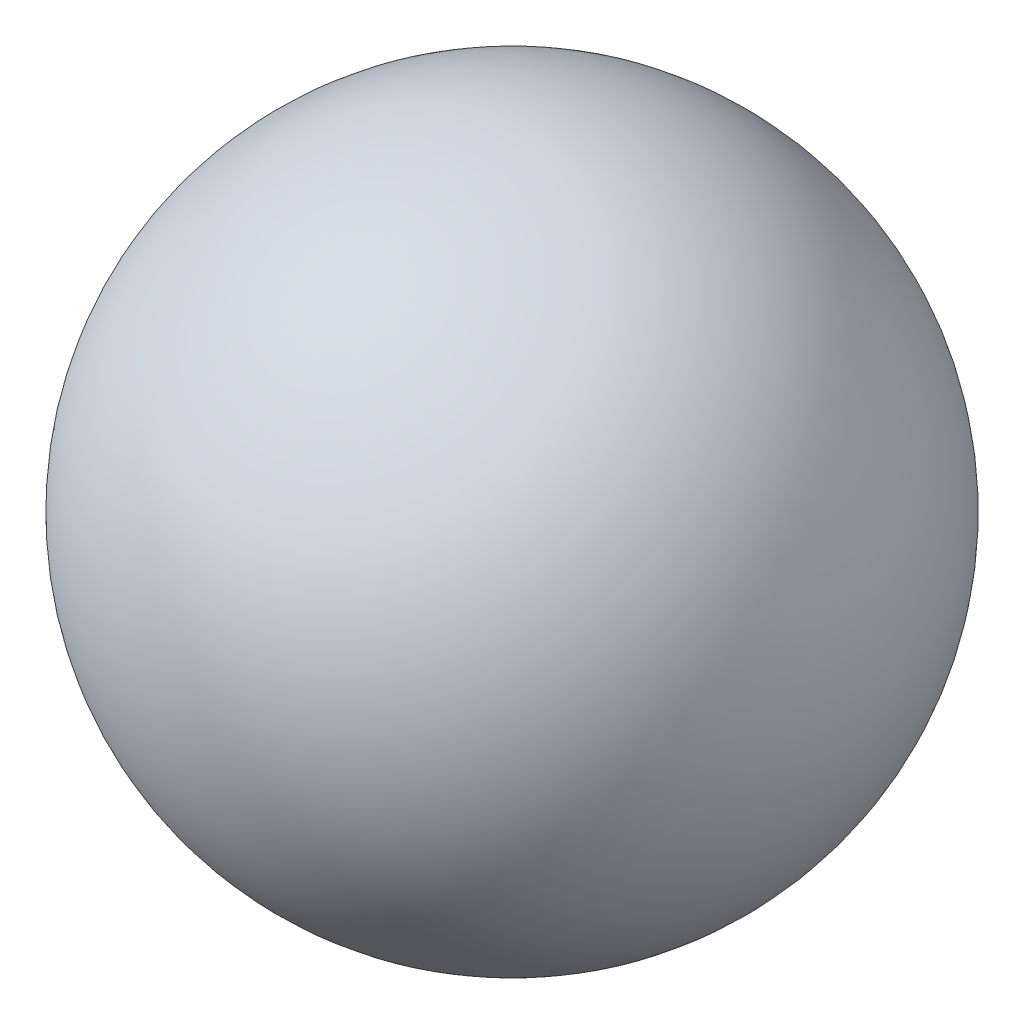
ISO-10303-21;
HEADER;
FILE_DESCRIPTION(('STEP AP214'),'2;1');
FILE_NAME('part.step','',(''),(''),'','','');
FILE_SCHEMA(('AUTOMOTIVE_DESIGN { 1 0 10303 214 1 1 1 1 }'));
ENDSEC;
DATA;
#1=APPLICATION_CONTEXT('core data for automotive mechanical design processes');
#2=APPLICATION_PROTOCOL_DEFINITION('international standard','automotive_design',2000,#1);
#3=PRODUCT_CONTEXT('',#1,'mechanical');
#4=PRODUCT('Part','Part','',(#3));
#5=PRODUCT_RELATED_PRODUCT_CATEGORY('part','',(#4));
#6=PRODUCT_DEFINITION_FORMATION('','',#4);
#7=PRODUCT_DEFINITION_CONTEXT('part definition',#1,'design');
#8=PRODUCT_DEFINITION('design','',#6,#7);
#9=PRODUCT_DEFINITION_SHAPE('','',#8);
#10=(LENGTH_UNIT() NAMED_UNIT(*) SI_UNIT(.MILLI.,.METRE.));
#11=(NAMED_UNIT(*) PLANE_ANGLE_UNIT() SI_UNIT($,.RADIAN.));
#12=(NAMED_UNIT(*) SI_UNIT($,.STERADIAN.) SOLID_ANGLE_UNIT());
#13=UNCERTAINTY_MEASURE_WITH_UNIT(LENGTH_MEASURE(1.E-05),#10,'distance_accuracy_value','');
#14=(GEOMETRIC_REPRESENTATION_CONTEXT(3) GLOBAL_UNCERTAINTY_ASSIGNED_CONTEXT((#13)) GLOBAL_UNIT_ASSIGNED_CONTEXT((#10,
#11,#12)) REPRESENTATION_CONTEXT('',''));
#15=CARTESIAN_POINT('',(0.,0.,0.));
#16=DIRECTION('',(0.,0.,1.));
#17=DIRECTION('',(1.,0.,0.));
#18=AXIS2_PLACEMENT_3D('',#15,#16,#17);
#19=CARTESIAN_POINT('',(0.,0.,0.));
#20=DIRECTION('',(0.,1.,0.));
#21=DIRECTION('',(1.,0.,0.));
#22=AXIS2_PLACEMENT_3D('',#19,#20,#21);
#23=SPHERICAL_SURFACE('',#22,21.335);
#24=CARTESIAN_POINT('',(0.,21.335,0.));
#25=VERTEX_POINT('',#24);
#26=VERTEX_LOOP('',#25);
#27=FACE_BOUND('',#26,.T.);
#28=ADVANCED_FACE('F31',(#27),#23,.T.);
#29=CLOSED_SHELL('',(#28));
#30=MANIFOLD_SOLID_BREP('B2',#29);
#31=ADVANCED_BREP_SHAPE_REPRESENTATION('',(#18,#30),#14);
#32=SHAPE_DEFINITION_REPRESENTATION(#9,#31);
ENDSEC;
END-ISO-10303-21;
